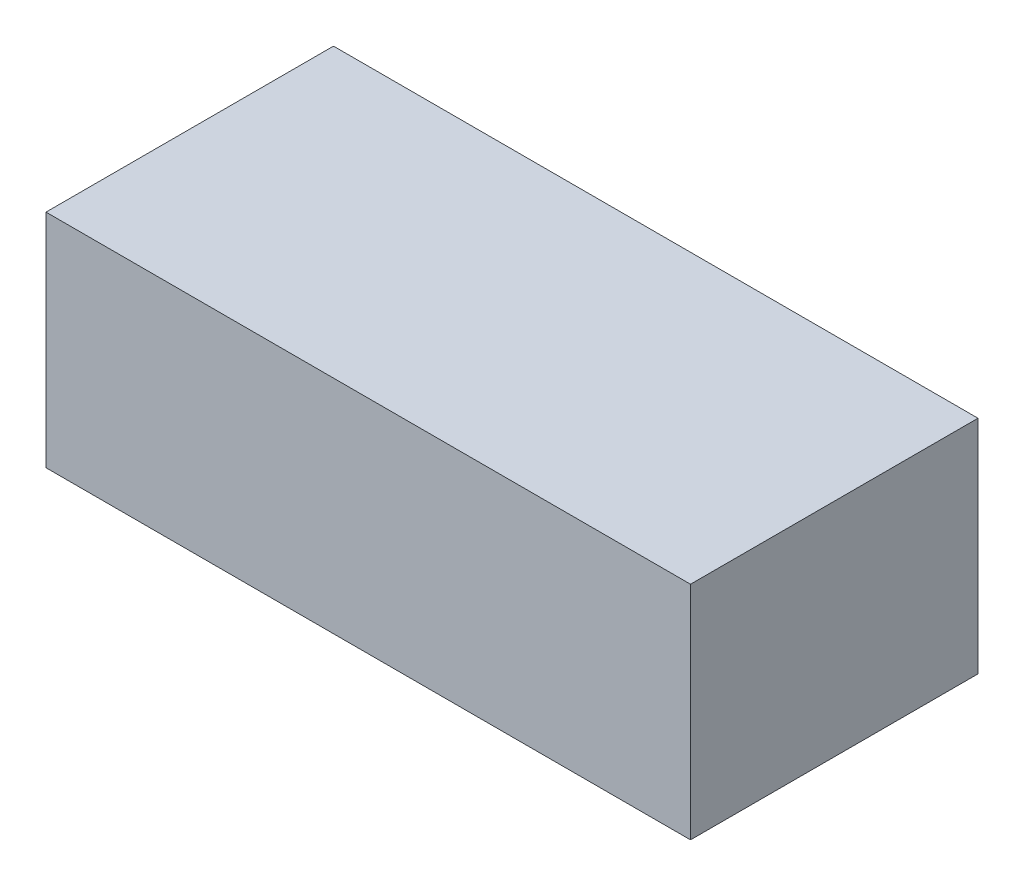
ISO-10303-21;
HEADER;
FILE_DESCRIPTION(('STEP AP214'),'2;1');
FILE_NAME('part.step','',(''),(''),'','','');
FILE_SCHEMA(('AUTOMOTIVE_DESIGN { 1 0 10303 214 1 1 1 1 }'));
ENDSEC;
DATA;
#1=APPLICATION_CONTEXT('core data for automotive mechanical design processes');
#2=APPLICATION_PROTOCOL_DEFINITION('international standard','automotive_design',2000,#1);
#3=PRODUCT_CONTEXT('',#1,'mechanical');
#4=PRODUCT('Part','Part','',(#3));
#5=PRODUCT_RELATED_PRODUCT_CATEGORY('part','',(#4));
#6=PRODUCT_DEFINITION_FORMATION('','',#4);
#7=PRODUCT_DEFINITION_CONTEXT('part definition',#1,'design');
#8=PRODUCT_DEFINITION('design','',#6,#7);
#9=PRODUCT_DEFINITION_SHAPE('','',#8);
#10=(LENGTH_UNIT() NAMED_UNIT(*) SI_UNIT(.MILLI.,.METRE.));
#11=(NAMED_UNIT(*) PLANE_ANGLE_UNIT() SI_UNIT($,.RADIAN.));
#12=(NAMED_UNIT(*) SI_UNIT($,.STERADIAN.) SOLID_ANGLE_UNIT());
#13=UNCERTAINTY_MEASURE_WITH_UNIT(LENGTH_MEASURE(1.E-05),#10,'distance_accuracy_value','');
#14=(GEOMETRIC_REPRESENTATION_CONTEXT(3) GLOBAL_UNCERTAINTY_ASSIGNED_CONTEXT((#13)) GLOBAL_UNIT_ASSIGNED_CONTEXT((#10,
#11,#12)) REPRESENTATION_CONTEXT('',''));
#15=CARTESIAN_POINT('',(0.,0.,0.));
#16=DIRECTION('',(0.,0.,1.));
#17=DIRECTION('',(1.,0.,0.));
#18=AXIS2_PLACEMENT_3D('',#15,#16,#17);
#19=CARTESIAN_POINT('',(75.1,-12.9,-16.75));
#20=DIRECTION('',(0.,0.,1.));
#21=DIRECTION('',(1.,0.,0.));
#22=AXIS2_PLACEMENT_3D('',#19,#20,#21);
#23=PLANE('',#22);
#24=DIRECTION('',(0.,1.,0.));
#25=VECTOR('',#24,1.);
#26=CARTESIAN_POINT('',(0.,-12.9,-16.75));
#27=LINE('',#26,#25);
#28=CARTESIAN_POINT('',(0.,-12.9,-16.75));
#29=VERTEX_POINT('',#28);
#30=CARTESIAN_POINT('',(0.,12.9,-16.75));
#31=VERTEX_POINT('',#30);
#32=EDGE_CURVE('E111',#29,#31,#27,.T.);
#33=ORIENTED_EDGE('',*,*,#32,.T.);
#34=DIRECTION('',(-1.,0.,0.));
#35=VECTOR('',#34,1.);
#36=CARTESIAN_POINT('',(75.1,12.9,-16.75));
#37=LINE('',#36,#35);
#38=CARTESIAN_POINT('',(75.1,12.9,-16.75));
#39=VERTEX_POINT('',#38);
#40=EDGE_CURVE('E11',#39,#31,#37,.T.);
#41=ORIENTED_EDGE('',*,*,#40,.F.);
#42=DIRECTION('',(0.,1.,0.));
#43=VECTOR('',#42,1.);
#44=CARTESIAN_POINT('',(75.1,-12.9,-16.75));
#45=LINE('',#44,#43);
#46=CARTESIAN_POINT('',(75.1,-12.9,-16.75));
#47=VERTEX_POINT('',#46);
#48=EDGE_CURVE('E95',#47,#39,#45,.T.);
#49=ORIENTED_EDGE('',*,*,#48,.F.);
#50=DIRECTION('',(-1.,0.,0.));
#51=VECTOR('',#50,1.);
#52=CARTESIAN_POINT('',(75.1,-12.9,-16.75));
#53=LINE('',#52,#51);
#54=EDGE_CURVE('E107',#47,#29,#53,.T.);
#55=ORIENTED_EDGE('',*,*,#54,.T.);
#56=EDGE_LOOP('',(#33,#41,#49,#55));
#57=FACE_BOUND('',#56,.T.);
#58=ADVANCED_FACE('F43',(#57),#23,.F.);
#59=CARTESIAN_POINT('',(75.1,12.9,16.75));
#60=DIRECTION('',(0.,-1.,0.));
#61=DIRECTION('',(0.,0.,-1.));
#62=AXIS2_PLACEMENT_3D('',#59,#60,#61);
#63=PLANE('',#62);
#64=DIRECTION('',(0.,0.,1.));
#65=VECTOR('',#64,1.);
#66=CARTESIAN_POINT('',(0.,12.9,16.75));
#67=LINE('',#66,#65);
#68=CARTESIAN_POINT('',(0.,12.9,16.75));
#69=VERTEX_POINT('',#68);
#70=EDGE_CURVE('E100',#31,#69,#67,.T.);
#71=ORIENTED_EDGE('',*,*,#70,.T.);
#72=DIRECTION('',(-1.,0.,0.));
#73=VECTOR('',#72,1.);
#74=CARTESIAN_POINT('',(75.1,12.9,16.75));
#75=LINE('',#74,#73);
#76=CARTESIAN_POINT('',(75.1,12.9,16.75));
#77=VERTEX_POINT('',#76);
#78=EDGE_CURVE('E52',#77,#69,#75,.T.);
#79=ORIENTED_EDGE('',*,*,#78,.F.);
#80=DIRECTION('',(0.,0.,1.));
#81=VECTOR('',#80,1.);
#82=CARTESIAN_POINT('',(75.1,12.9,16.75));
#83=LINE('',#82,#81);
#84=EDGE_CURVE('E90',#39,#77,#83,.T.);
#85=ORIENTED_EDGE('',*,*,#84,.F.);
#86=ORIENTED_EDGE('',*,*,#40,.T.);
#87=EDGE_LOOP('',(#71,#79,#85,#86));
#88=FACE_BOUND('',#87,.T.);
#89=ADVANCED_FACE('F99',(#88),#63,.F.);
#90=CARTESIAN_POINT('',(75.1,-12.9,16.75));
#91=DIRECTION('',(0.,0.,-1.));
#92=DIRECTION('',(-1.,0.,0.));
#93=AXIS2_PLACEMENT_3D('',#90,#91,#92);
#94=PLANE('',#93);
#95=DIRECTION('',(0.,-1.,0.));
#96=VECTOR('',#95,1.);
#97=CARTESIAN_POINT('',(0.,-12.9,16.75));
#98=LINE('',#97,#96);
#99=CARTESIAN_POINT('',(0.,-12.9,16.75));
#100=VERTEX_POINT('',#99);
#101=EDGE_CURVE('E77',#69,#100,#98,.T.);
#102=ORIENTED_EDGE('',*,*,#101,.T.);
#103=DIRECTION('',(-1.,0.,0.));
#104=VECTOR('',#103,1.);
#105=CARTESIAN_POINT('',(75.1,-12.9,16.75));
#106=LINE('',#105,#104);
#107=CARTESIAN_POINT('',(75.1,-12.9,16.75));
#108=VERTEX_POINT('',#107);
#109=EDGE_CURVE('E102',#108,#100,#106,.T.);
#110=ORIENTED_EDGE('',*,*,#109,.F.);
#111=DIRECTION('',(0.,-1.,0.));
#112=VECTOR('',#111,1.);
#113=CARTESIAN_POINT('',(75.1,-12.9,16.75));
#114=LINE('',#113,#112);
#115=EDGE_CURVE('E93',#77,#108,#114,.T.);
#116=ORIENTED_EDGE('',*,*,#115,.F.);
#117=ORIENTED_EDGE('',*,*,#78,.T.);
#118=EDGE_LOOP('',(#102,#110,#116,#117));
#119=FACE_BOUND('',#118,.T.);
#120=ADVANCED_FACE('F103',(#119),#94,.F.);
#121=CARTESIAN_POINT('',(75.1,-12.9,16.75));
#122=DIRECTION('',(0.,1.,0.));
#123=DIRECTION('',(0.,0.,1.));
#124=AXIS2_PLACEMENT_3D('',#121,#122,#123);
#125=PLANE('',#124);
#126=DIRECTION('',(0.,0.,-1.));
#127=VECTOR('',#126,1.);
#128=CARTESIAN_POINT('',(0.,-12.9,16.75));
#129=LINE('',#128,#127);
#130=EDGE_CURVE('E83',#100,#29,#129,.T.);
#131=ORIENTED_EDGE('',*,*,#130,.T.);
#132=ORIENTED_EDGE('',*,*,#54,.F.);
#133=DIRECTION('',(0.,0.,-1.));
#134=VECTOR('',#133,1.);
#135=CARTESIAN_POINT('',(75.1,-12.9,16.75));
#136=LINE('',#135,#134);
#137=EDGE_CURVE('E60',#108,#47,#136,.T.);
#138=ORIENTED_EDGE('',*,*,#137,.F.);
#139=ORIENTED_EDGE('',*,*,#109,.T.);
#140=EDGE_LOOP('',(#131,#132,#138,#139));
#141=FACE_BOUND('',#140,.T.);
#142=ADVANCED_FACE('F124',(#141),#125,.F.);
#143=CARTESIAN_POINT('',(75.1,0.,0.));
#144=DIRECTION('',(-1.,0.,0.));
#145=DIRECTION('',(0.,0.,1.));
#146=AXIS2_PLACEMENT_3D('',#143,#144,#145);
#147=PLANE('',#146);
#148=ORIENTED_EDGE('',*,*,#48,.T.);
#149=ORIENTED_EDGE('',*,*,#84,.T.);
#150=ORIENTED_EDGE('',*,*,#115,.T.);
#151=ORIENTED_EDGE('',*,*,#137,.T.);
#152=EDGE_LOOP('',(#148,#149,#150,#151));
#153=FACE_BOUND('',#152,.T.);
#154=ADVANCED_FACE('F91',(#153),#147,.F.);
#155=CARTESIAN_POINT('',(0.,0.,0.));
#156=DIRECTION('',(-1.,0.,0.));
#157=DIRECTION('',(0.,0.,1.));
#158=AXIS2_PLACEMENT_3D('',#155,#156,#157);
#159=PLANE('',#158);
#160=ORIENTED_EDGE('',*,*,#32,.F.);
#161=ORIENTED_EDGE('',*,*,#130,.F.);
#162=ORIENTED_EDGE('',*,*,#101,.F.);
#163=ORIENTED_EDGE('',*,*,#70,.F.);
#164=EDGE_LOOP('',(#160,#161,#162,#163));
#165=FACE_BOUND('',#164,.T.);
#166=ADVANCED_FACE('F127',(#165),#159,.T.);
#167=CLOSED_SHELL('',(#58,#89,#120,#142,#154,#166));
#168=MANIFOLD_SOLID_BREP('B2',#167);
#169=ADVANCED_BREP_SHAPE_REPRESENTATION('',(#18,#168),#14);
#170=SHAPE_DEFINITION_REPRESENTATION(#9,#169);
ENDSEC;
END-ISO-10303-21;
